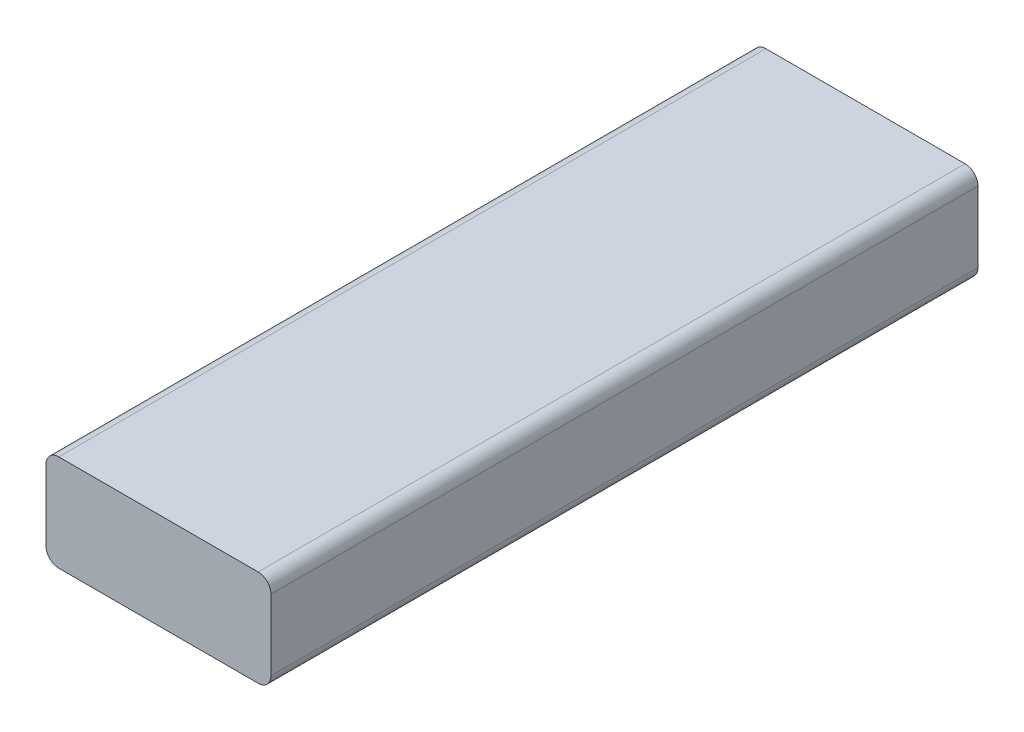
ISO-10303-21;
HEADER;
FILE_DESCRIPTION(('STEP AP214'),'2;1');
FILE_NAME('part.step','',(''),(''),'','','');
FILE_SCHEMA(('AUTOMOTIVE_DESIGN { 1 0 10303 214 1 1 1 1 }'));
ENDSEC;
DATA;
#1=APPLICATION_CONTEXT('core data for automotive mechanical design processes');
#2=APPLICATION_PROTOCOL_DEFINITION('international standard','automotive_design',2000,#1);
#3=PRODUCT_CONTEXT('',#1,'mechanical');
#4=PRODUCT('Part','Part','',(#3));
#5=PRODUCT_RELATED_PRODUCT_CATEGORY('part','',(#4));
#6=PRODUCT_DEFINITION_FORMATION('','',#4);
#7=PRODUCT_DEFINITION_CONTEXT('part definition',#1,'design');
#8=PRODUCT_DEFINITION('design','',#6,#7);
#9=PRODUCT_DEFINITION_SHAPE('','',#8);
#10=(LENGTH_UNIT() NAMED_UNIT(*) SI_UNIT(.MILLI.,.METRE.));
#11=(NAMED_UNIT(*) PLANE_ANGLE_UNIT() SI_UNIT($,.RADIAN.));
#12=(NAMED_UNIT(*) SI_UNIT($,.STERADIAN.) SOLID_ANGLE_UNIT());
#13=UNCERTAINTY_MEASURE_WITH_UNIT(LENGTH_MEASURE(1.E-05),#10,'distance_accuracy_value','');
#14=(GEOMETRIC_REPRESENTATION_CONTEXT(3) GLOBAL_UNCERTAINTY_ASSIGNED_CONTEXT((#13)) GLOBAL_UNIT_ASSIGNED_CONTEXT((#10,
#11,#12)) REPRESENTATION_CONTEXT('',''));
#15=CARTESIAN_POINT('',(0.,0.,0.));
#16=DIRECTION('',(0.,0.,1.));
#17=DIRECTION('',(1.,0.,0.));
#18=AXIS2_PLACEMENT_3D('',#15,#16,#17);
#19=CARTESIAN_POINT('',(0.,0.,279.4));
#20=DIRECTION('',(1.,0.,0.));
#21=DIRECTION('',(0.,0.,-1.));
#22=AXIS2_PLACEMENT_3D('',#19,#20,#21);
#23=PLANE('',#22);
#24=DIRECTION('',(0.,-1.,0.));
#25=VECTOR('',#24,1.);
#26=CARTESIAN_POINT('',(0.,0.,0.));
#27=LINE('',#26,#25);
#28=CARTESIAN_POINT('',(0.,33.02,0.));
#29=VERTEX_POINT('',#28);
#30=CARTESIAN_POINT('',(0.,5.08,0.));
#31=VERTEX_POINT('',#30);
#32=EDGE_CURVE('E129',#29,#31,#27,.T.);
#33=ORIENTED_EDGE('',*,*,#32,.T.);
#34=DIRECTION('',(0.,0.,-1.));
#35=VECTOR('',#34,1.);
#36=CARTESIAN_POINT('',(0.,5.08,279.4));
#37=LINE('',#36,#35);
#38=CARTESIAN_POINT('',(0.,5.08,279.4));
#39=VERTEX_POINT('',#38);
#40=EDGE_CURVE('E152',#31,#39,#37,.F.);
#41=ORIENTED_EDGE('',*,*,#40,.T.);
#42=DIRECTION('',(0.,-1.,0.));
#43=VECTOR('',#42,1.);
#44=CARTESIAN_POINT('',(0.,0.,279.4));
#45=LINE('',#44,#43);
#46=CARTESIAN_POINT('',(0.,33.02,279.4));
#47=VERTEX_POINT('',#46);
#48=EDGE_CURVE('E127',#47,#39,#45,.T.);
#49=ORIENTED_EDGE('',*,*,#48,.F.);
#50=DIRECTION('',(0.,0.,-1.));
#51=VECTOR('',#50,1.);
#52=CARTESIAN_POINT('',(0.,33.02,279.4));
#53=LINE('',#52,#51);
#54=EDGE_CURVE('E149',#47,#29,#53,.T.);
#55=ORIENTED_EDGE('',*,*,#54,.T.);
#56=EDGE_LOOP('',(#33,#41,#49,#55));
#57=FACE_BOUND('',#56,.T.);
#58=ADVANCED_FACE('F34',(#57),#23,.F.);
#59=CARTESIAN_POINT('',(0.,0.,279.4));
#60=DIRECTION('',(0.,1.,0.));
#61=DIRECTION('',(0.,0.,1.));
#62=AXIS2_PLACEMENT_3D('',#59,#60,#61);
#63=PLANE('',#62);
#64=DIRECTION('',(1.,0.,0.));
#65=VECTOR('',#64,1.);
#66=CARTESIAN_POINT('',(0.,0.,0.));
#67=LINE('',#66,#65);
#68=CARTESIAN_POINT('',(5.08,0.,0.));
#69=VERTEX_POINT('',#68);
#70=CARTESIAN_POINT('',(83.82,0.,0.));
#71=VERTEX_POINT('',#70);
#72=EDGE_CURVE('E125',#69,#71,#67,.T.);
#73=ORIENTED_EDGE('',*,*,#72,.T.);
#74=DIRECTION('',(0.,0.,-1.));
#75=VECTOR('',#74,1.);
#76=CARTESIAN_POINT('',(83.82,0.,279.4));
#77=LINE('',#76,#75);
#78=CARTESIAN_POINT('',(83.82,0.,279.4));
#79=VERTEX_POINT('',#78);
#80=EDGE_CURVE('E104',#71,#79,#77,.F.);
#81=ORIENTED_EDGE('',*,*,#80,.T.);
#82=DIRECTION('',(1.,0.,0.));
#83=VECTOR('',#82,1.);
#84=CARTESIAN_POINT('',(0.,0.,279.4));
#85=LINE('',#84,#83);
#86=CARTESIAN_POINT('',(5.08,0.,279.4));
#87=VERTEX_POINT('',#86);
#88=EDGE_CURVE('E168',#87,#79,#85,.T.);
#89=ORIENTED_EDGE('',*,*,#88,.F.);
#90=DIRECTION('',(0.,0.,-1.));
#91=VECTOR('',#90,1.);
#92=CARTESIAN_POINT('',(5.08,0.,279.4));
#93=LINE('',#92,#91);
#94=EDGE_CURVE('E109',#87,#69,#93,.T.);
#95=ORIENTED_EDGE('',*,*,#94,.T.);
#96=EDGE_LOOP('',(#73,#81,#89,#95));
#97=FACE_BOUND('',#96,.T.);
#98=ADVANCED_FACE('F185',(#97),#63,.F.);
#99=CARTESIAN_POINT('',(88.9,0.,279.4));
#100=DIRECTION('',(-1.,0.,0.));
#101=DIRECTION('',(0.,0.,1.));
#102=AXIS2_PLACEMENT_3D('',#99,#100,#101);
#103=PLANE('',#102);
#104=DIRECTION('',(0.,1.,0.));
#105=VECTOR('',#104,1.);
#106=CARTESIAN_POINT('',(88.9,0.,279.4));
#107=LINE('',#106,#105);
#108=CARTESIAN_POINT('',(88.9,5.08,279.4));
#109=VERTEX_POINT('',#108);
#110=CARTESIAN_POINT('',(88.9,33.02,279.4));
#111=VERTEX_POINT('',#110);
#112=EDGE_CURVE('E118',#109,#111,#107,.T.);
#113=ORIENTED_EDGE('',*,*,#112,.F.);
#114=DIRECTION('',(0.,0.,-1.));
#115=VECTOR('',#114,1.);
#116=CARTESIAN_POINT('',(88.9,5.08,279.4));
#117=LINE('',#116,#115);
#118=CARTESIAN_POINT('',(88.9,5.08,0.));
#119=VERTEX_POINT('',#118);
#120=EDGE_CURVE('E103',#109,#119,#117,.T.);
#121=ORIENTED_EDGE('',*,*,#120,.T.);
#122=DIRECTION('',(0.,1.,0.));
#123=VECTOR('',#122,1.);
#124=CARTESIAN_POINT('',(88.9,0.,0.));
#125=LINE('',#124,#123);
#126=CARTESIAN_POINT('',(88.9,33.02,0.));
#127=VERTEX_POINT('',#126);
#128=EDGE_CURVE('E116',#119,#127,#125,.T.);
#129=ORIENTED_EDGE('',*,*,#128,.T.);
#130=DIRECTION('',(0.,0.,-1.));
#131=VECTOR('',#130,1.);
#132=CARTESIAN_POINT('',(88.9,33.02,279.4));
#133=LINE('',#132,#131);
#134=EDGE_CURVE('E120',#127,#111,#133,.F.);
#135=ORIENTED_EDGE('',*,*,#134,.T.);
#136=EDGE_LOOP('',(#113,#121,#129,#135));
#137=FACE_BOUND('',#136,.T.);
#138=ADVANCED_FACE('F115',(#137),#103,.F.);
#139=CARTESIAN_POINT('',(0.,38.1,279.4));
#140=DIRECTION('',(0.,-1.,0.));
#141=DIRECTION('',(0.,0.,-1.));
#142=AXIS2_PLACEMENT_3D('',#139,#140,#141);
#143=PLANE('',#142);
#144=DIRECTION('',(-1.,0.,0.));
#145=VECTOR('',#144,1.);
#146=CARTESIAN_POINT('',(0.,38.1,0.));
#147=LINE('',#146,#145);
#148=CARTESIAN_POINT('',(83.82,38.1,0.));
#149=VERTEX_POINT('',#148);
#150=CARTESIAN_POINT('',(5.08,38.1,0.));
#151=VERTEX_POINT('',#150);
#152=EDGE_CURVE('E124',#149,#151,#147,.T.);
#153=ORIENTED_EDGE('',*,*,#152,.T.);
#154=DIRECTION('',(0.,0.,-1.));
#155=VECTOR('',#154,1.);
#156=CARTESIAN_POINT('',(5.08,38.1,279.4));
#157=LINE('',#156,#155);
#158=CARTESIAN_POINT('',(5.08,38.1,279.4));
#159=VERTEX_POINT('',#158);
#160=EDGE_CURVE('E11',#151,#159,#157,.F.);
#161=ORIENTED_EDGE('',*,*,#160,.T.);
#162=DIRECTION('',(-1.,0.,0.));
#163=VECTOR('',#162,1.);
#164=CARTESIAN_POINT('',(0.,38.1,279.4));
#165=LINE('',#164,#163);
#166=CARTESIAN_POINT('',(83.82,38.1,279.4));
#167=VERTEX_POINT('',#166);
#168=EDGE_CURVE('E133',#167,#159,#165,.T.);
#169=ORIENTED_EDGE('',*,*,#168,.F.);
#170=DIRECTION('',(0.,0.,-1.));
#171=VECTOR('',#170,1.);
#172=CARTESIAN_POINT('',(83.82,38.1,279.4));
#173=LINE('',#172,#171);
#174=EDGE_CURVE('E42',#167,#149,#173,.T.);
#175=ORIENTED_EDGE('',*,*,#174,.T.);
#176=EDGE_LOOP('',(#153,#161,#169,#175));
#177=FACE_BOUND('',#176,.T.);
#178=ADVANCED_FACE('F155',(#177),#143,.F.);
#179=CARTESIAN_POINT('',(0.,0.,279.4));
#180=DIRECTION('',(0.,0.,-1.));
#181=DIRECTION('',(-1.,0.,0.));
#182=AXIS2_PLACEMENT_3D('',#179,#180,#181);
#183=PLANE('',#182);
#184=ORIENTED_EDGE('',*,*,#88,.T.);
#185=CARTESIAN_POINT('',(83.82,5.08,279.4));
#186=DIRECTION('',(0.,0.,-1.));
#187=DIRECTION('',(-1.,0.,0.));
#188=AXIS2_PLACEMENT_3D('',#185,#186,#187);
#189=CIRCLE('',#188,5.08);
#190=EDGE_CURVE('E147',#79,#109,#189,.F.);
#191=ORIENTED_EDGE('',*,*,#190,.T.);
#192=ORIENTED_EDGE('',*,*,#112,.T.);
#193=CARTESIAN_POINT('',(83.82,33.02,279.4));
#194=DIRECTION('',(0.,0.,-1.));
#195=DIRECTION('',(-1.,0.,0.));
#196=AXIS2_PLACEMENT_3D('',#193,#194,#195);
#197=CIRCLE('',#196,5.08);
#198=EDGE_CURVE('E54',#111,#167,#197,.F.);
#199=ORIENTED_EDGE('',*,*,#198,.T.);
#200=ORIENTED_EDGE('',*,*,#168,.T.);
#201=CARTESIAN_POINT('',(5.08,33.02,279.4));
#202=DIRECTION('',(0.,0.,-1.));
#203=DIRECTION('',(-1.,0.,0.));
#204=AXIS2_PLACEMENT_3D('',#201,#202,#203);
#205=CIRCLE('',#204,5.08);
#206=EDGE_CURVE('E143',#159,#47,#205,.F.);
#207=ORIENTED_EDGE('',*,*,#206,.T.);
#208=ORIENTED_EDGE('',*,*,#48,.T.);
#209=CARTESIAN_POINT('',(5.08,5.08,279.4));
#210=DIRECTION('',(0.,0.,-1.));
#211=DIRECTION('',(-1.,0.,0.));
#212=AXIS2_PLACEMENT_3D('',#209,#210,#211);
#213=CIRCLE('',#212,5.08);
#214=EDGE_CURVE('E145',#39,#87,#213,.F.);
#215=ORIENTED_EDGE('',*,*,#214,.T.);
#216=EDGE_LOOP('',(#184,#191,#192,#199,#200,#207,#208,#215));
#217=FACE_BOUND('',#216,.T.);
#218=ADVANCED_FACE('F174',(#217),#183,.F.);
#219=CARTESIAN_POINT('',(0.,0.,0.));
#220=DIRECTION('',(0.,0.,-1.));
#221=DIRECTION('',(-1.,0.,0.));
#222=AXIS2_PLACEMENT_3D('',#219,#220,#221);
#223=PLANE('',#222);
#224=ORIENTED_EDGE('',*,*,#128,.F.);
#225=CARTESIAN_POINT('',(83.82,5.08,0.));
#226=DIRECTION('',(0.,0.,-1.));
#227=DIRECTION('',(-1.,0.,0.));
#228=AXIS2_PLACEMENT_3D('',#225,#226,#227);
#229=CIRCLE('',#228,5.08);
#230=EDGE_CURVE('E99',#119,#71,#229,.T.);
#231=ORIENTED_EDGE('',*,*,#230,.T.);
#232=ORIENTED_EDGE('',*,*,#72,.F.);
#233=CARTESIAN_POINT('',(5.08,5.08,0.));
#234=DIRECTION('',(0.,0.,-1.));
#235=DIRECTION('',(-1.,0.,0.));
#236=AXIS2_PLACEMENT_3D('',#233,#234,#235);
#237=CIRCLE('',#236,5.08);
#238=EDGE_CURVE('E110',#69,#31,#237,.T.);
#239=ORIENTED_EDGE('',*,*,#238,.T.);
#240=ORIENTED_EDGE('',*,*,#32,.F.);
#241=CARTESIAN_POINT('',(5.08,33.02,0.));
#242=DIRECTION('',(0.,0.,-1.));
#243=DIRECTION('',(-1.,0.,0.));
#244=AXIS2_PLACEMENT_3D('',#241,#242,#243);
#245=CIRCLE('',#244,5.08);
#246=EDGE_CURVE('E136',#29,#151,#245,.T.);
#247=ORIENTED_EDGE('',*,*,#246,.T.);
#248=ORIENTED_EDGE('',*,*,#152,.F.);
#249=CARTESIAN_POINT('',(83.82,33.02,0.));
#250=DIRECTION('',(0.,0.,-1.));
#251=DIRECTION('',(-1.,0.,0.));
#252=AXIS2_PLACEMENT_3D('',#249,#250,#251);
#253=CIRCLE('',#252,5.08);
#254=EDGE_CURVE('E119',#149,#127,#253,.T.);
#255=ORIENTED_EDGE('',*,*,#254,.T.);
#256=EDGE_LOOP('',(#224,#231,#232,#239,#240,#247,#248,#255));
#257=FACE_BOUND('',#256,.T.);
#258=ADVANCED_FACE('F122',(#257),#223,.T.);
#259=CARTESIAN_POINT('',(83.82,5.08,279.4));
#260=DIRECTION('',(0.,0.,-1.));
#261=DIRECTION('',(-1.,0.,0.));
#262=AXIS2_PLACEMENT_3D('',#259,#260,#261);
#263=CYLINDRICAL_SURFACE('',#262,5.08);
#264=ORIENTED_EDGE('',*,*,#190,.F.);
#265=ORIENTED_EDGE('',*,*,#80,.F.);
#266=ORIENTED_EDGE('',*,*,#230,.F.);
#267=ORIENTED_EDGE('',*,*,#120,.F.);
#268=EDGE_LOOP('',(#264,#265,#266,#267));
#269=FACE_BOUND('',#268,.T.);
#270=ADVANCED_FACE('F102',(#269),#263,.T.);
#271=CARTESIAN_POINT('',(5.08,5.08,279.4));
#272=DIRECTION('',(0.,0.,-1.));
#273=DIRECTION('',(-1.,0.,0.));
#274=AXIS2_PLACEMENT_3D('',#271,#272,#273);
#275=CYLINDRICAL_SURFACE('',#274,5.08);
#276=ORIENTED_EDGE('',*,*,#214,.F.);
#277=ORIENTED_EDGE('',*,*,#40,.F.);
#278=ORIENTED_EDGE('',*,*,#238,.F.);
#279=ORIENTED_EDGE('',*,*,#94,.F.);
#280=EDGE_LOOP('',(#276,#277,#278,#279));
#281=FACE_BOUND('',#280,.T.);
#282=ADVANCED_FACE('F196',(#281),#275,.T.);
#283=CARTESIAN_POINT('',(5.08,33.02,279.4));
#284=DIRECTION('',(0.,0.,-1.));
#285=DIRECTION('',(-1.,0.,0.));
#286=AXIS2_PLACEMENT_3D('',#283,#284,#285);
#287=CYLINDRICAL_SURFACE('',#286,5.08);
#288=ORIENTED_EDGE('',*,*,#206,.F.);
#289=ORIENTED_EDGE('',*,*,#160,.F.);
#290=ORIENTED_EDGE('',*,*,#246,.F.);
#291=ORIENTED_EDGE('',*,*,#54,.F.);
#292=EDGE_LOOP('',(#288,#289,#290,#291));
#293=FACE_BOUND('',#292,.T.);
#294=ADVANCED_FACE('F162',(#293),#287,.T.);
#295=CARTESIAN_POINT('',(83.82,33.02,279.4));
#296=DIRECTION('',(0.,0.,-1.));
#297=DIRECTION('',(-1.,0.,0.));
#298=AXIS2_PLACEMENT_3D('',#295,#296,#297);
#299=CYLINDRICAL_SURFACE('',#298,5.08);
#300=ORIENTED_EDGE('',*,*,#198,.F.);
#301=ORIENTED_EDGE('',*,*,#134,.F.);
#302=ORIENTED_EDGE('',*,*,#254,.F.);
#303=ORIENTED_EDGE('',*,*,#174,.F.);
#304=EDGE_LOOP('',(#300,#301,#302,#303));
#305=FACE_BOUND('',#304,.T.);
#306=ADVANCED_FACE('F36',(#305),#299,.T.);
#307=CLOSED_SHELL('',(#58,#98,#138,#178,#218,#258,#270,#282,#294,#306));
#308=MANIFOLD_SOLID_BREP('B2',#307);
#309=ADVANCED_BREP_SHAPE_REPRESENTATION('',(#18,#308),#14);
#310=SHAPE_DEFINITION_REPRESENTATION(#9,#309);
ENDSEC;
END-ISO-10303-21;
